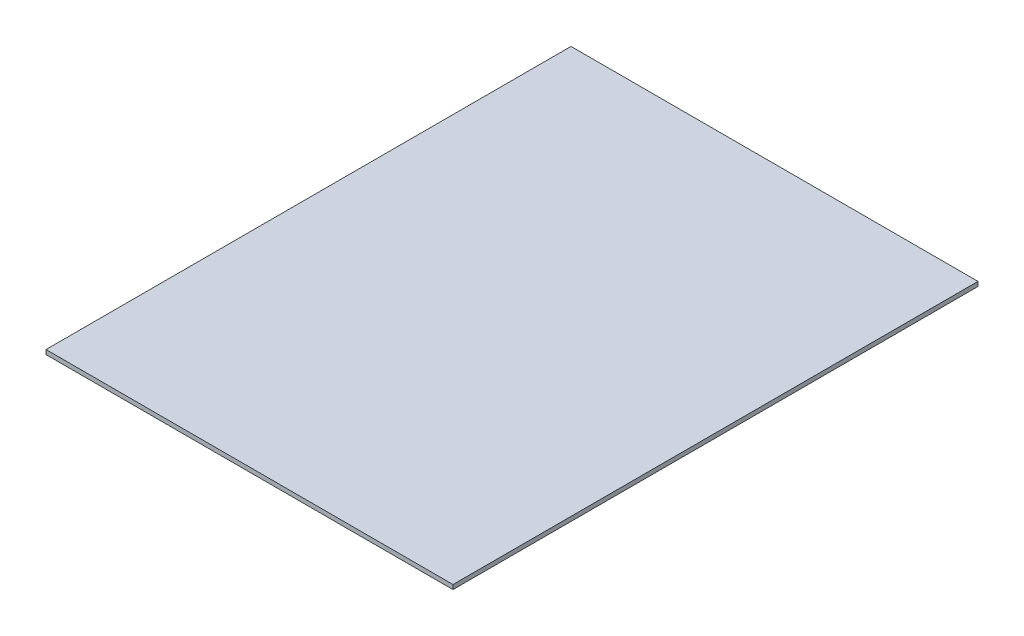
ISO-10303-21;
HEADER;
FILE_DESCRIPTION(('STEP AP214'),'2;1');
FILE_NAME('part.step','',(''),(''),'','','');
FILE_SCHEMA(('AUTOMOTIVE_DESIGN { 1 0 10303 214 1 1 1 1 }'));
ENDSEC;
DATA;
#1=APPLICATION_CONTEXT('core data for automotive mechanical design processes');
#2=APPLICATION_PROTOCOL_DEFINITION('international standard','automotive_design',2000,#1);
#3=PRODUCT_CONTEXT('',#1,'mechanical');
#4=PRODUCT('Part','Part','',(#3));
#5=PRODUCT_RELATED_PRODUCT_CATEGORY('part','',(#4));
#6=PRODUCT_DEFINITION_FORMATION('','',#4);
#7=PRODUCT_DEFINITION_CONTEXT('part definition',#1,'design');
#8=PRODUCT_DEFINITION('design','',#6,#7);
#9=PRODUCT_DEFINITION_SHAPE('','',#8);
#10=(LENGTH_UNIT() NAMED_UNIT(*) SI_UNIT(.MILLI.,.METRE.));
#11=(NAMED_UNIT(*) PLANE_ANGLE_UNIT() SI_UNIT($,.RADIAN.));
#12=(NAMED_UNIT(*) SI_UNIT($,.STERADIAN.) SOLID_ANGLE_UNIT());
#13=UNCERTAINTY_MEASURE_WITH_UNIT(LENGTH_MEASURE(1.E-05),#10,'distance_accuracy_value','');
#14=(GEOMETRIC_REPRESENTATION_CONTEXT(3) GLOBAL_UNCERTAINTY_ASSIGNED_CONTEXT((#13)) GLOBAL_UNIT_ASSIGNED_CONTEXT((#10,
#11,#12)) REPRESENTATION_CONTEXT('',''));
#15=CARTESIAN_POINT('',(0.,0.,0.));
#16=DIRECTION('',(0.,0.,1.));
#17=DIRECTION('',(1.,0.,0.));
#18=AXIS2_PLACEMENT_3D('',#15,#16,#17);
#19=CARTESIAN_POINT('',(292.89375,6.35,377.825));
#20=DIRECTION('',(-1.,0.,0.));
#21=DIRECTION('',(0.,0.,1.));
#22=AXIS2_PLACEMENT_3D('',#19,#20,#21);
#23=PLANE('',#22);
#24=DIRECTION('',(0.,0.,-1.));
#25=VECTOR('',#24,1.);
#26=CARTESIAN_POINT('',(292.89375,0.,377.825));
#27=LINE('',#26,#25);
#28=CARTESIAN_POINT('',(292.89375,0.,377.825));
#29=VERTEX_POINT('',#28);
#30=CARTESIAN_POINT('',(292.89375,0.,-377.825));
#31=VERTEX_POINT('',#30);
#32=EDGE_CURVE('E111',#29,#31,#27,.T.);
#33=ORIENTED_EDGE('',*,*,#32,.T.);
#34=DIRECTION('',(0.,-1.,0.));
#35=VECTOR('',#34,1.);
#36=CARTESIAN_POINT('',(292.89375,6.35,-377.825));
#37=LINE('',#36,#35);
#38=CARTESIAN_POINT('',(292.89375,6.35,-377.825));
#39=VERTEX_POINT('',#38);
#40=EDGE_CURVE('E11',#39,#31,#37,.T.);
#41=ORIENTED_EDGE('',*,*,#40,.F.);
#42=DIRECTION('',(0.,0.,-1.));
#43=VECTOR('',#42,1.);
#44=CARTESIAN_POINT('',(292.89375,6.35,377.825));
#45=LINE('',#44,#43);
#46=CARTESIAN_POINT('',(292.89375,6.35,377.825));
#47=VERTEX_POINT('',#46);
#48=EDGE_CURVE('E95',#47,#39,#45,.T.);
#49=ORIENTED_EDGE('',*,*,#48,.F.);
#50=DIRECTION('',(0.,-1.,0.));
#51=VECTOR('',#50,1.);
#52=CARTESIAN_POINT('',(292.89375,6.35,377.825));
#53=LINE('',#52,#51);
#54=EDGE_CURVE('E107',#47,#29,#53,.T.);
#55=ORIENTED_EDGE('',*,*,#54,.T.);
#56=EDGE_LOOP('',(#33,#41,#49,#55));
#57=FACE_BOUND('',#56,.T.);
#58=ADVANCED_FACE('F43',(#57),#23,.F.);
#59=CARTESIAN_POINT('',(-292.89375,6.35,-377.825));
#60=DIRECTION('',(0.,0.,1.));
#61=DIRECTION('',(1.,0.,0.));
#62=AXIS2_PLACEMENT_3D('',#59,#60,#61);
#63=PLANE('',#62);
#64=DIRECTION('',(-1.,0.,0.));
#65=VECTOR('',#64,1.);
#66=CARTESIAN_POINT('',(-292.89375,0.,-377.825));
#67=LINE('',#66,#65);
#68=CARTESIAN_POINT('',(-292.89375,0.,-377.825));
#69=VERTEX_POINT('',#68);
#70=EDGE_CURVE('E100',#31,#69,#67,.T.);
#71=ORIENTED_EDGE('',*,*,#70,.T.);
#72=DIRECTION('',(0.,-1.,0.));
#73=VECTOR('',#72,1.);
#74=CARTESIAN_POINT('',(-292.89375,6.35,-377.825));
#75=LINE('',#74,#73);
#76=CARTESIAN_POINT('',(-292.89375,6.35,-377.825));
#77=VERTEX_POINT('',#76);
#78=EDGE_CURVE('E52',#77,#69,#75,.T.);
#79=ORIENTED_EDGE('',*,*,#78,.F.);
#80=DIRECTION('',(-1.,0.,0.));
#81=VECTOR('',#80,1.);
#82=CARTESIAN_POINT('',(-292.89375,6.35,-377.825));
#83=LINE('',#82,#81);
#84=EDGE_CURVE('E90',#39,#77,#83,.T.);
#85=ORIENTED_EDGE('',*,*,#84,.F.);
#86=ORIENTED_EDGE('',*,*,#40,.T.);
#87=EDGE_LOOP('',(#71,#79,#85,#86));
#88=FACE_BOUND('',#87,.T.);
#89=ADVANCED_FACE('F99',(#88),#63,.F.);
#90=CARTESIAN_POINT('',(-292.89375,6.35,377.825));
#91=DIRECTION('',(1.,0.,0.));
#92=DIRECTION('',(0.,0.,-1.));
#93=AXIS2_PLACEMENT_3D('',#90,#91,#92);
#94=PLANE('',#93);
#95=DIRECTION('',(0.,0.,1.));
#96=VECTOR('',#95,1.);
#97=CARTESIAN_POINT('',(-292.89375,0.,377.825));
#98=LINE('',#97,#96);
#99=CARTESIAN_POINT('',(-292.89375,0.,377.825));
#100=VERTEX_POINT('',#99);
#101=EDGE_CURVE('E77',#69,#100,#98,.T.);
#102=ORIENTED_EDGE('',*,*,#101,.T.);
#103=DIRECTION('',(0.,-1.,0.));
#104=VECTOR('',#103,1.);
#105=CARTESIAN_POINT('',(-292.89375,6.35,377.825));
#106=LINE('',#105,#104);
#107=CARTESIAN_POINT('',(-292.89375,6.35,377.825));
#108=VERTEX_POINT('',#107);
#109=EDGE_CURVE('E102',#108,#100,#106,.T.);
#110=ORIENTED_EDGE('',*,*,#109,.F.);
#111=DIRECTION('',(0.,0.,1.));
#112=VECTOR('',#111,1.);
#113=CARTESIAN_POINT('',(-292.89375,6.35,377.825));
#114=LINE('',#113,#112);
#115=EDGE_CURVE('E93',#77,#108,#114,.T.);
#116=ORIENTED_EDGE('',*,*,#115,.F.);
#117=ORIENTED_EDGE('',*,*,#78,.T.);
#118=EDGE_LOOP('',(#102,#110,#116,#117));
#119=FACE_BOUND('',#118,.T.);
#120=ADVANCED_FACE('F103',(#119),#94,.F.);
#121=CARTESIAN_POINT('',(-292.89375,6.35,377.825));
#122=DIRECTION('',(0.,0.,-1.));
#123=DIRECTION('',(-1.,0.,0.));
#124=AXIS2_PLACEMENT_3D('',#121,#122,#123);
#125=PLANE('',#124);
#126=DIRECTION('',(1.,0.,0.));
#127=VECTOR('',#126,1.);
#128=CARTESIAN_POINT('',(-292.89375,0.,377.825));
#129=LINE('',#128,#127);
#130=EDGE_CURVE('E83',#100,#29,#129,.T.);
#131=ORIENTED_EDGE('',*,*,#130,.T.);
#132=ORIENTED_EDGE('',*,*,#54,.F.);
#133=DIRECTION('',(1.,0.,0.));
#134=VECTOR('',#133,1.);
#135=CARTESIAN_POINT('',(-292.89375,6.35,377.825));
#136=LINE('',#135,#134);
#137=EDGE_CURVE('E60',#108,#47,#136,.T.);
#138=ORIENTED_EDGE('',*,*,#137,.F.);
#139=ORIENTED_EDGE('',*,*,#109,.T.);
#140=EDGE_LOOP('',(#131,#132,#138,#139));
#141=FACE_BOUND('',#140,.T.);
#142=ADVANCED_FACE('F124',(#141),#125,.F.);
#143=CARTESIAN_POINT('',(0.,6.35,0.));
#144=DIRECTION('',(0.,-1.,0.));
#145=DIRECTION('',(0.,0.,-1.));
#146=AXIS2_PLACEMENT_3D('',#143,#144,#145);
#147=PLANE('',#146);
#148=ORIENTED_EDGE('',*,*,#48,.T.);
#149=ORIENTED_EDGE('',*,*,#84,.T.);
#150=ORIENTED_EDGE('',*,*,#115,.T.);
#151=ORIENTED_EDGE('',*,*,#137,.T.);
#152=EDGE_LOOP('',(#148,#149,#150,#151));
#153=FACE_BOUND('',#152,.T.);
#154=ADVANCED_FACE('F91',(#153),#147,.F.);
#155=CARTESIAN_POINT('',(0.,0.,0.));
#156=DIRECTION('',(0.,-1.,0.));
#157=DIRECTION('',(0.,0.,-1.));
#158=AXIS2_PLACEMENT_3D('',#155,#156,#157);
#159=PLANE('',#158);
#160=ORIENTED_EDGE('',*,*,#32,.F.);
#161=ORIENTED_EDGE('',*,*,#130,.F.);
#162=ORIENTED_EDGE('',*,*,#101,.F.);
#163=ORIENTED_EDGE('',*,*,#70,.F.);
#164=EDGE_LOOP('',(#160,#161,#162,#163));
#165=FACE_BOUND('',#164,.T.);
#166=ADVANCED_FACE('F127',(#165),#159,.T.);
#167=CLOSED_SHELL('',(#58,#89,#120,#142,#154,#166));
#168=MANIFOLD_SOLID_BREP('B2',#167);
#169=ADVANCED_BREP_SHAPE_REPRESENTATION('',(#18,#168),#14);
#170=SHAPE_DEFINITION_REPRESENTATION(#9,#169);
ENDSEC;
END-ISO-10303-21;
